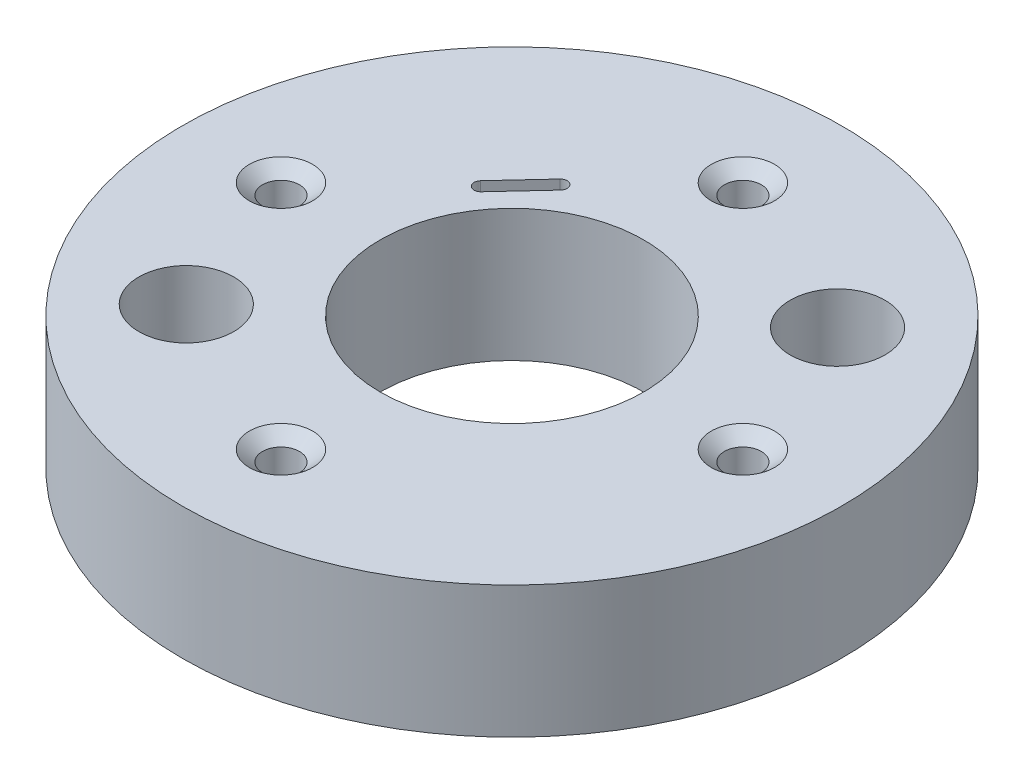
ISO-10303-21;
HEADER;
FILE_DESCRIPTION(('STEP AP214'),'2;1');
FILE_NAME('part.step','',(''),(''),'','','');
FILE_SCHEMA(('AUTOMOTIVE_DESIGN { 1 0 10303 214 1 1 1 1 }'));
ENDSEC;
DATA;
#1=APPLICATION_CONTEXT('core data for automotive mechanical design processes');
#2=APPLICATION_PROTOCOL_DEFINITION('international standard','automotive_design',2000,#1);
#3=PRODUCT_CONTEXT('',#1,'mechanical');
#4=PRODUCT('Part','Part','',(#3));
#5=PRODUCT_RELATED_PRODUCT_CATEGORY('part','',(#4));
#6=PRODUCT_DEFINITION_FORMATION('','',#4);
#7=PRODUCT_DEFINITION_CONTEXT('part definition',#1,'design');
#8=PRODUCT_DEFINITION('design','',#6,#7);
#9=PRODUCT_DEFINITION_SHAPE('','',#8);
#10=(LENGTH_UNIT() NAMED_UNIT(*) SI_UNIT(.MILLI.,.METRE.));
#11=(NAMED_UNIT(*) PLANE_ANGLE_UNIT() SI_UNIT($,.RADIAN.));
#12=(NAMED_UNIT(*) SI_UNIT($,.STERADIAN.) SOLID_ANGLE_UNIT());
#13=UNCERTAINTY_MEASURE_WITH_UNIT(LENGTH_MEASURE(1.E-05),#10,'distance_accuracy_value','');
#14=(GEOMETRIC_REPRESENTATION_CONTEXT(3) GLOBAL_UNCERTAINTY_ASSIGNED_CONTEXT((#13)) GLOBAL_UNIT_ASSIGNED_CONTEXT((#10,
#11,#12)) REPRESENTATION_CONTEXT('',''));
#15=CARTESIAN_POINT('',(0.,0.,0.));
#16=DIRECTION('',(0.,0.,1.));
#17=DIRECTION('',(1.,0.,0.));
#18=AXIS2_PLACEMENT_3D('',#15,#16,#17);
#19=CARTESIAN_POINT('',(0.,6.35,0.));
#20=DIRECTION('',(0.,1.,0.));
#21=DIRECTION('',(0.,0.,1.));
#22=AXIS2_PLACEMENT_3D('',#19,#20,#21);
#23=PLANE('',#22);
#24=CARTESIAN_POINT('',(-8.32891159723607,6.35,7.35641814033341));
#25=DIRECTION('',(0.,1.,0.));
#26=DIRECTION('',(0.,0.,-1.));
#27=AXIS2_PLACEMENT_3D('',#24,#25,#26);
#28=CIRCLE('',#27,2.286);
#29=CARTESIAN_POINT('',(-8.32891159723607,6.35,5.07041814033341));
#30=VERTEX_POINT('',#29);
#31=EDGE_CURVE('E103',#30,#30,#28,.T.);
#32=ORIENTED_EDGE('',*,*,#31,.F.);
#33=EDGE_LOOP('',(#32));
#34=FACE_BOUND('',#33,.T.);
#35=CARTESIAN_POINT('',(8.32891159723607,6.35,-7.35641814033341));
#36=DIRECTION('',(0.,1.,0.));
#37=DIRECTION('',(0.,0.,1.));
#38=AXIS2_PLACEMENT_3D('',#35,#36,#37);
#39=CIRCLE('',#38,2.286);
#40=CARTESIAN_POINT('',(8.32891159723607,6.35,-5.07041814033341));
#41=VERTEX_POINT('',#40);
#42=EDGE_CURVE('E126',#41,#41,#39,.T.);
#43=ORIENTED_EDGE('',*,*,#42,.F.);
#44=EDGE_LOOP('',(#43));
#45=FACE_BOUND('',#44,.T.);
#46=CARTESIAN_POINT('',(-11.1252,6.35,0.));
#47=DIRECTION('',(0.,1.,0.));
#48=DIRECTION('',(0.,0.,1.));
#49=AXIS2_PLACEMENT_3D('',#46,#47,#48);
#50=CIRCLE('',#49,1.524);
#51=CARTESIAN_POINT('',(-11.1252,6.35,1.524));
#52=VERTEX_POINT('',#51);
#53=EDGE_CURVE('E132',#52,#52,#50,.T.);
#54=ORIENTED_EDGE('',*,*,#53,.F.);
#55=EDGE_LOOP('',(#54));
#56=FACE_BOUND('',#55,.T.);
#57=CARTESIAN_POINT('',(11.1252,6.35,0.));
#58=DIRECTION('',(0.,1.,0.));
#59=DIRECTION('',(0.,0.,1.));
#60=AXIS2_PLACEMENT_3D('',#57,#58,#59);
#61=CIRCLE('',#60,1.524);
#62=CARTESIAN_POINT('',(11.1252,6.35,1.524));
#63=VERTEX_POINT('',#62);
#64=EDGE_CURVE('E143',#63,#63,#61,.T.);
#65=ORIENTED_EDGE('',*,*,#64,.F.);
#66=EDGE_LOOP('',(#65));
#67=FACE_BOUND('',#66,.T.);
#68=CARTESIAN_POINT('',(0.,6.35,11.1252));
#69=DIRECTION('',(0.,1.,0.));
#70=DIRECTION('',(0.,0.,1.));
#71=AXIS2_PLACEMENT_3D('',#68,#69,#70);
#72=CIRCLE('',#71,1.524);
#73=CARTESIAN_POINT('',(0.,6.35,12.6492));
#74=VERTEX_POINT('',#73);
#75=EDGE_CURVE('E152',#74,#74,#72,.T.);
#76=ORIENTED_EDGE('',*,*,#75,.F.);
#77=EDGE_LOOP('',(#76));
#78=FACE_BOUND('',#77,.T.);
#79=CARTESIAN_POINT('',(0.,6.35,-11.1252));
#80=DIRECTION('',(0.,1.,0.));
#81=DIRECTION('',(0.,0.,1.));
#82=AXIS2_PLACEMENT_3D('',#79,#80,#81);
#83=CIRCLE('',#82,1.524);
#84=CARTESIAN_POINT('',(0.,6.35,-9.6012));
#85=VERTEX_POINT('',#84);
#86=EDGE_CURVE('E161',#85,#85,#83,.T.);
#87=ORIENTED_EDGE('',*,*,#86,.F.);
#88=EDGE_LOOP('',(#87));
#89=FACE_BOUND('',#88,.T.);
#90=CARTESIAN_POINT('',(0.,6.35,0.));
#91=DIRECTION('',(0.,1.,0.));
#92=DIRECTION('',(0.,0.,1.));
#93=AXIS2_PLACEMENT_3D('',#90,#91,#92);
#94=CIRCLE('',#93,6.35);
#95=CARTESIAN_POINT('',(0.,6.35,6.35));
#96=VERTEX_POINT('',#95);
#97=EDGE_CURVE('E170',#96,#96,#94,.T.);
#98=ORIENTED_EDGE('',*,*,#97,.F.);
#99=EDGE_LOOP('',(#98));
#100=FACE_BOUND('',#99,.T.);
#101=CARTESIAN_POINT('',(0.,6.35,0.));
#102=DIRECTION('',(0.,1.,0.));
#103=DIRECTION('',(0.,0.,1.));
#104=AXIS2_PLACEMENT_3D('',#101,#102,#103);
#105=CIRCLE('',#104,15.875);
#106=CARTESIAN_POINT('',(0.,6.35,15.875));
#107=VERTEX_POINT('',#106);
#108=EDGE_CURVE('E11',#107,#107,#105,.T.);
#109=ORIENTED_EDGE('',*,*,#108,.T.);
#110=EDGE_LOOP('',(#109));
#111=FACE_BOUND('',#110,.T.);
#112=CARTESIAN_POINT('',(-6.15769241715111,6.35,-4.66085783906228));
#113=DIRECTION('',(0.,1.,0.));
#114=DIRECTION('',(0.,0.,1.));
#115=AXIS2_PLACEMENT_3D('',#112,#113,#114);
#116=CIRCLE('',#115,0.327254868180187);
#117=CARTESIAN_POINT('',(-6.39758263951138,6.35,-4.88345260531605));
#118=VERTEX_POINT('',#117);
#119=CARTESIAN_POINT('',(-5.91780219479084,6.35,-4.43826307280851));
#120=VERTEX_POINT('',#119);
#121=EDGE_CURVE('E96',#118,#120,#116,.T.);
#122=ORIENTED_EDGE('',*,*,#121,.F.);
#123=DIRECTION('',(0.680187792137623,0.,-0.733037903131172));
#124=VECTOR('',#123,1.);
#125=CARTESIAN_POINT('',(-6.39758263951138,6.35,-4.88345260531605));
#126=LINE('',#125,#124);
#127=CARTESIAN_POINT('',(-4.55415128901584,6.35,-6.87011726962409));
#128=VERTEX_POINT('',#127);
#129=EDGE_CURVE('E55',#118,#128,#126,.T.);
#130=ORIENTED_EDGE('',*,*,#129,.T.);
#131=CARTESIAN_POINT('',(-4.31426106665557,6.35,-6.64752250337032));
#132=DIRECTION('',(0.,1.,0.));
#133=DIRECTION('',(0.,0.,1.));
#134=AXIS2_PLACEMENT_3D('',#131,#132,#133);
#135=CIRCLE('',#134,0.327254868180187);
#136=CARTESIAN_POINT('',(-4.07437084429529,6.35,-6.42492773711655));
#137=VERTEX_POINT('',#136);
#138=EDGE_CURVE('E102',#137,#128,#135,.T.);
#139=ORIENTED_EDGE('',*,*,#138,.F.);
#140=DIRECTION('',(0.680187792137623,0.,-0.733037903131172));
#141=VECTOR('',#140,1.);
#142=CARTESIAN_POINT('',(-5.91780219479084,6.35,-4.43826307280851));
#143=LINE('',#142,#141);
#144=EDGE_CURVE('E114',#120,#137,#143,.T.);
#145=ORIENTED_EDGE('',*,*,#144,.F.);
#146=EDGE_LOOP('',(#122,#130,#139,#145));
#147=FACE_BOUND('',#146,.T.);
#148=ADVANCED_FACE('F40',(#34,#45,#56,#67,#78,#89,#100,#111,#147),#23,.T.);
#149=CARTESIAN_POINT('',(0.,0.,0.));
#150=DIRECTION('',(0.,1.,0.));
#151=DIRECTION('',(0.,0.,1.));
#152=AXIS2_PLACEMENT_3D('',#149,#150,#151);
#153=PLANE('',#152);
#154=CARTESIAN_POINT('',(0.,0.,0.));
#155=DIRECTION('',(0.,1.,0.));
#156=DIRECTION('',(0.,0.,1.));
#157=AXIS2_PLACEMENT_3D('',#154,#155,#156);
#158=CIRCLE('',#157,15.875);
#159=CARTESIAN_POINT('',(0.,0.,15.875));
#160=VERTEX_POINT('',#159);
#161=EDGE_CURVE('E44',#160,#160,#158,.T.);
#162=ORIENTED_EDGE('',*,*,#161,.F.);
#163=EDGE_LOOP('',(#162));
#164=FACE_BOUND('',#163,.T.);
#165=CARTESIAN_POINT('',(0.,0.,0.));
#166=DIRECTION('',(0.,1.,0.));
#167=DIRECTION('',(0.,0.,1.));
#168=AXIS2_PLACEMENT_3D('',#165,#166,#167);
#169=CIRCLE('',#168,6.35);
#170=CARTESIAN_POINT('',(0.,0.,6.35));
#171=VERTEX_POINT('',#170);
#172=EDGE_CURVE('E171',#171,#171,#169,.T.);
#173=ORIENTED_EDGE('',*,*,#172,.T.);
#174=EDGE_LOOP('',(#173));
#175=FACE_BOUND('',#174,.T.);
#176=CARTESIAN_POINT('',(0.,0.,-11.1252));
#177=DIRECTION('',(0.,1.,0.));
#178=DIRECTION('',(0.,0.,1.));
#179=AXIS2_PLACEMENT_3D('',#176,#177,#178);
#180=CIRCLE('',#179,0.888999999999998);
#181=CARTESIAN_POINT('',(0.,0.,-10.2362));
#182=VERTEX_POINT('',#181);
#183=EDGE_CURVE('E167',#182,#182,#180,.T.);
#184=ORIENTED_EDGE('',*,*,#183,.T.);
#185=EDGE_LOOP('',(#184));
#186=FACE_BOUND('',#185,.T.);
#187=CARTESIAN_POINT('',(0.,0.,11.1252));
#188=DIRECTION('',(0.,1.,0.));
#189=DIRECTION('',(0.,0.,1.));
#190=AXIS2_PLACEMENT_3D('',#187,#188,#189);
#191=CIRCLE('',#190,0.888999999999998);
#192=CARTESIAN_POINT('',(0.,0.,12.0142));
#193=VERTEX_POINT('',#192);
#194=EDGE_CURVE('E158',#193,#193,#191,.T.);
#195=ORIENTED_EDGE('',*,*,#194,.T.);
#196=EDGE_LOOP('',(#195));
#197=FACE_BOUND('',#196,.T.);
#198=CARTESIAN_POINT('',(8.32891159723607,0.,-7.35641814033341));
#199=DIRECTION('',(0.,1.,0.));
#200=DIRECTION('',(0.,0.,1.));
#201=AXIS2_PLACEMENT_3D('',#198,#199,#200);
#202=CIRCLE('',#201,2.286);
#203=CARTESIAN_POINT('',(8.32891159723607,0.,-5.07041814033341));
#204=VERTEX_POINT('',#203);
#205=EDGE_CURVE('E129',#204,#204,#202,.T.);
#206=ORIENTED_EDGE('',*,*,#205,.T.);
#207=EDGE_LOOP('',(#206));
#208=FACE_BOUND('',#207,.T.);
#209=CARTESIAN_POINT('',(-8.32891159723607,0.,7.35641814033341));
#210=DIRECTION('',(0.,1.,0.));
#211=DIRECTION('',(0.,0.,-1.));
#212=AXIS2_PLACEMENT_3D('',#209,#210,#211);
#213=CIRCLE('',#212,2.286);
#214=CARTESIAN_POINT('',(-8.32891159723607,0.,5.07041814033341));
#215=VERTEX_POINT('',#214);
#216=EDGE_CURVE('E123',#215,#215,#213,.T.);
#217=ORIENTED_EDGE('',*,*,#216,.T.);
#218=EDGE_LOOP('',(#217));
#219=FACE_BOUND('',#218,.T.);
#220=DIRECTION('',(0.680187792137623,0.,-0.733037903131172));
#221=VECTOR('',#220,1.);
#222=CARTESIAN_POINT('',(-6.39758263951138,0.,-4.88345260531605));
#223=LINE('',#222,#221);
#224=CARTESIAN_POINT('',(-6.39758263951138,0.,-4.88345260531605));
#225=VERTEX_POINT('',#224);
#226=CARTESIAN_POINT('',(-4.55415128901584,0.,-6.87011726962409));
#227=VERTEX_POINT('',#226);
#228=EDGE_CURVE('E85',#225,#227,#223,.T.);
#229=ORIENTED_EDGE('',*,*,#228,.F.);
#230=CARTESIAN_POINT('',(-6.15769241715111,0.,-4.66085783906228));
#231=DIRECTION('',(0.,1.,0.));
#232=DIRECTION('',(0.,0.,1.));
#233=AXIS2_PLACEMENT_3D('',#230,#231,#232);
#234=CIRCLE('',#233,0.327254868180187);
#235=CARTESIAN_POINT('',(-5.91780219479084,0.,-4.43826307280851));
#236=VERTEX_POINT('',#235);
#237=EDGE_CURVE('E108',#225,#236,#234,.T.);
#238=ORIENTED_EDGE('',*,*,#237,.T.);
#239=DIRECTION('',(0.680187792137623,0.,-0.733037903131172));
#240=VECTOR('',#239,1.);
#241=CARTESIAN_POINT('',(-5.91780219479084,0.,-4.43826307280851));
#242=LINE('',#241,#240);
#243=CARTESIAN_POINT('',(-4.07437084429529,0.,-6.42492773711655));
#244=VERTEX_POINT('',#243);
#245=EDGE_CURVE('E63',#236,#244,#242,.T.);
#246=ORIENTED_EDGE('',*,*,#245,.T.);
#247=CARTESIAN_POINT('',(-4.31426106665557,0.,-6.64752250337032));
#248=DIRECTION('',(0.,1.,0.));
#249=DIRECTION('',(0.,0.,1.));
#250=AXIS2_PLACEMENT_3D('',#247,#248,#249);
#251=CIRCLE('',#250,0.327254868180187);
#252=EDGE_CURVE('E95',#244,#227,#251,.T.);
#253=ORIENTED_EDGE('',*,*,#252,.T.);
#254=EDGE_LOOP('',(#229,#238,#246,#253));
#255=FACE_BOUND('',#254,.T.);
#256=ADVANCED_FACE('F106',(#164,#175,#186,#197,#208,#219,#255),#153,.F.);
#257=CARTESIAN_POINT('',(0.,6.35,0.));
#258=DIRECTION('',(0.,-1.,0.));
#259=DIRECTION('',(0.,0.,-1.));
#260=AXIS2_PLACEMENT_3D('',#257,#258,#259);
#261=CYLINDRICAL_SURFACE('',#260,15.875);
#262=ORIENTED_EDGE('',*,*,#108,.F.);
#263=EDGE_LOOP('',(#262));
#264=FACE_BOUND('',#263,.T.);
#265=ORIENTED_EDGE('',*,*,#161,.T.);
#266=EDGE_LOOP('',(#265));
#267=FACE_BOUND('',#266,.T.);
#268=ADVANCED_FACE('F42',(#264,#267),#261,.T.);
#269=CARTESIAN_POINT('',(0.,0.,0.));
#270=DIRECTION('',(0.,1.,0.));
#271=DIRECTION('',(0.,0.,1.));
#272=AXIS2_PLACEMENT_3D('',#269,#270,#271);
#273=CYLINDRICAL_SURFACE('',#272,6.35);
#274=ORIENTED_EDGE('',*,*,#172,.F.);
#275=EDGE_LOOP('',(#274));
#276=FACE_BOUND('',#275,.T.);
#277=ORIENTED_EDGE('',*,*,#97,.T.);
#278=EDGE_LOOP('',(#277));
#279=FACE_BOUND('',#278,.T.);
#280=ADVANCED_FACE('F177',(#276,#279),#273,.F.);
#281=CARTESIAN_POINT('',(0.,6.35,-11.1252));
#282=DIRECTION('',(0.,1.,0.));
#283=DIRECTION('',(0.,0.,1.));
#284=AXIS2_PLACEMENT_3D('',#281,#282,#283);
#285=CYLINDRICAL_SURFACE('',#284,0.888999999999999);
#286=ORIENTED_EDGE('',*,*,#183,.F.);
#287=EDGE_LOOP('',(#286));
#288=FACE_BOUND('',#287,.T.);
#289=CARTESIAN_POINT('',(0.,5.81717173420243,-11.1252));
#290=DIRECTION('',(0.,1.,0.));
#291=DIRECTION('',(0.,0.,1.));
#292=AXIS2_PLACEMENT_3D('',#289,#290,#291);
#293=CIRCLE('',#292,0.888999999999999);
#294=CARTESIAN_POINT('',(0.,5.81717173420243,-10.2362));
#295=VERTEX_POINT('',#294);
#296=EDGE_CURVE('E164',#295,#295,#293,.T.);
#297=ORIENTED_EDGE('',*,*,#296,.T.);
#298=EDGE_LOOP('',(#297));
#299=FACE_BOUND('',#298,.T.);
#300=ADVANCED_FACE('F244',(#288,#299),#285,.F.);
#301=CARTESIAN_POINT('',(0.,6.35,-11.1252));
#302=DIRECTION('',(0.,1.,0.));
#303=DIRECTION('',(0.,0.,1.));
#304=AXIS2_PLACEMENT_3D('',#301,#302,#303);
#305=CONICAL_SURFACE('',#304,1.524,0.872664625997164);
#306=ORIENTED_EDGE('',*,*,#296,.F.);
#307=EDGE_LOOP('',(#306));
#308=FACE_BOUND('',#307,.T.);
#309=ORIENTED_EDGE('',*,*,#86,.T.);
#310=EDGE_LOOP('',(#309));
#311=FACE_BOUND('',#310,.T.);
#312=ADVANCED_FACE('F240',(#308,#311),#305,.F.);
#313=CARTESIAN_POINT('',(0.,6.35,11.1252));
#314=DIRECTION('',(0.,1.,0.));
#315=DIRECTION('',(0.,0.,1.));
#316=AXIS2_PLACEMENT_3D('',#313,#314,#315);
#317=CYLINDRICAL_SURFACE('',#316,0.888999999999999);
#318=ORIENTED_EDGE('',*,*,#194,.F.);
#319=EDGE_LOOP('',(#318));
#320=FACE_BOUND('',#319,.T.);
#321=CARTESIAN_POINT('',(0.,5.81717173420243,11.1252));
#322=DIRECTION('',(0.,1.,0.));
#323=DIRECTION('',(0.,0.,1.));
#324=AXIS2_PLACEMENT_3D('',#321,#322,#323);
#325=CIRCLE('',#324,0.888999999999999);
#326=CARTESIAN_POINT('',(0.,5.81717173420243,12.0142));
#327=VERTEX_POINT('',#326);
#328=EDGE_CURVE('E155',#327,#327,#325,.T.);
#329=ORIENTED_EDGE('',*,*,#328,.T.);
#330=EDGE_LOOP('',(#329));
#331=FACE_BOUND('',#330,.T.);
#332=ADVANCED_FACE('F236',(#320,#331),#317,.F.);
#333=CARTESIAN_POINT('',(0.,6.35,11.1252));
#334=DIRECTION('',(0.,1.,0.));
#335=DIRECTION('',(0.,0.,1.));
#336=AXIS2_PLACEMENT_3D('',#333,#334,#335);
#337=CONICAL_SURFACE('',#336,1.524,0.872664625997164);
#338=ORIENTED_EDGE('',*,*,#328,.F.);
#339=EDGE_LOOP('',(#338));
#340=FACE_BOUND('',#339,.T.);
#341=ORIENTED_EDGE('',*,*,#75,.T.);
#342=EDGE_LOOP('',(#341));
#343=FACE_BOUND('',#342,.T.);
#344=ADVANCED_FACE('F232',(#340,#343),#337,.F.);
#345=CARTESIAN_POINT('',(11.1252,2.54,0.));
#346=DIRECTION('',(0.,1.,0.));
#347=DIRECTION('',(0.,0.,1.));
#348=AXIS2_PLACEMENT_3D('',#345,#346,#347);
#349=CONICAL_SURFACE('',#348,0.888999999999999,1.02974425867665);
#350=CARTESIAN_POINT('',(11.1252,2.0058349096845,0.));
#351=VERTEX_POINT('',#350);
#352=VERTEX_LOOP('',#351);
#353=FACE_BOUND('',#352,.T.);
#354=CARTESIAN_POINT('',(11.1252,2.54,0.));
#355=DIRECTION('',(0.,1.,0.));
#356=DIRECTION('',(0.,0.,1.));
#357=AXIS2_PLACEMENT_3D('',#354,#355,#356);
#358=CIRCLE('',#357,0.888999999999999);
#359=CARTESIAN_POINT('',(11.1252,2.54,0.888999999999999));
#360=VERTEX_POINT('',#359);
#361=EDGE_CURVE('E149',#360,#360,#358,.T.);
#362=ORIENTED_EDGE('',*,*,#361,.T.);
#363=EDGE_LOOP('',(#362));
#364=FACE_BOUND('',#363,.T.);
#365=ADVANCED_FACE('F228',(#353,#364),#349,.F.);
#366=CARTESIAN_POINT('',(11.1252,6.35,0.));
#367=DIRECTION('',(0.,1.,0.));
#368=DIRECTION('',(0.,0.,1.));
#369=AXIS2_PLACEMENT_3D('',#366,#367,#368);
#370=CYLINDRICAL_SURFACE('',#369,0.888999999999999);
#371=ORIENTED_EDGE('',*,*,#361,.F.);
#372=EDGE_LOOP('',(#371));
#373=FACE_BOUND('',#372,.T.);
#374=CARTESIAN_POINT('',(11.1252,5.81717173420243,0.));
#375=DIRECTION('',(0.,1.,0.));
#376=DIRECTION('',(0.,0.,1.));
#377=AXIS2_PLACEMENT_3D('',#374,#375,#376);
#378=CIRCLE('',#377,0.888999999999999);
#379=CARTESIAN_POINT('',(11.1252,5.81717173420243,0.888999999999999));
#380=VERTEX_POINT('',#379);
#381=EDGE_CURVE('E146',#380,#380,#378,.T.);
#382=ORIENTED_EDGE('',*,*,#381,.T.);
#383=EDGE_LOOP('',(#382));
#384=FACE_BOUND('',#383,.T.);
#385=ADVANCED_FACE('F224',(#373,#384),#370,.F.);
#386=CARTESIAN_POINT('',(11.1252,6.35,0.));
#387=DIRECTION('',(0.,1.,0.));
#388=DIRECTION('',(0.,0.,1.));
#389=AXIS2_PLACEMENT_3D('',#386,#387,#388);
#390=CONICAL_SURFACE('',#389,1.524,0.872664625997164);
#391=ORIENTED_EDGE('',*,*,#381,.F.);
#392=EDGE_LOOP('',(#391));
#393=FACE_BOUND('',#392,.T.);
#394=ORIENTED_EDGE('',*,*,#64,.T.);
#395=EDGE_LOOP('',(#394));
#396=FACE_BOUND('',#395,.T.);
#397=ADVANCED_FACE('F220',(#393,#396),#390,.F.);
#398=CARTESIAN_POINT('',(-11.1252,2.54,0.));
#399=DIRECTION('',(0.,1.,0.));
#400=DIRECTION('',(0.,0.,1.));
#401=AXIS2_PLACEMENT_3D('',#398,#399,#400);
#402=CONICAL_SURFACE('',#401,0.888999999999999,1.02974425867665);
#403=CARTESIAN_POINT('',(-11.1252,2.0058349096845,0.));
#404=VERTEX_POINT('',#403);
#405=VERTEX_LOOP('',#404);
#406=FACE_BOUND('',#405,.T.);
#407=CARTESIAN_POINT('',(-11.1252,2.54,0.));
#408=DIRECTION('',(0.,1.,0.));
#409=DIRECTION('',(0.,0.,1.));
#410=AXIS2_PLACEMENT_3D('',#407,#408,#409);
#411=CIRCLE('',#410,0.888999999999999);
#412=CARTESIAN_POINT('',(-11.1252,2.54,0.888999999999999));
#413=VERTEX_POINT('',#412);
#414=EDGE_CURVE('E140',#413,#413,#411,.T.);
#415=ORIENTED_EDGE('',*,*,#414,.T.);
#416=EDGE_LOOP('',(#415));
#417=FACE_BOUND('',#416,.T.);
#418=ADVANCED_FACE('F216',(#406,#417),#402,.F.);
#419=CARTESIAN_POINT('',(-11.1252,6.35,0.));
#420=DIRECTION('',(0.,1.,0.));
#421=DIRECTION('',(0.,0.,1.));
#422=AXIS2_PLACEMENT_3D('',#419,#420,#421);
#423=CYLINDRICAL_SURFACE('',#422,0.888999999999999);
#424=ORIENTED_EDGE('',*,*,#414,.F.);
#425=EDGE_LOOP('',(#424));
#426=FACE_BOUND('',#425,.T.);
#427=CARTESIAN_POINT('',(-11.1252,5.81717173420243,0.));
#428=DIRECTION('',(0.,1.,0.));
#429=DIRECTION('',(0.,0.,1.));
#430=AXIS2_PLACEMENT_3D('',#427,#428,#429);
#431=CIRCLE('',#430,0.888999999999999);
#432=CARTESIAN_POINT('',(-11.1252,5.81717173420243,0.888999999999999));
#433=VERTEX_POINT('',#432);
#434=EDGE_CURVE('E137',#433,#433,#431,.T.);
#435=ORIENTED_EDGE('',*,*,#434,.T.);
#436=EDGE_LOOP('',(#435));
#437=FACE_BOUND('',#436,.T.);
#438=ADVANCED_FACE('F212',(#426,#437),#423,.F.);
#439=CARTESIAN_POINT('',(-11.1252,6.35,0.));
#440=DIRECTION('',(0.,1.,0.));
#441=DIRECTION('',(0.,0.,1.));
#442=AXIS2_PLACEMENT_3D('',#439,#440,#441);
#443=CONICAL_SURFACE('',#442,1.524,0.872664625997164);
#444=ORIENTED_EDGE('',*,*,#434,.F.);
#445=EDGE_LOOP('',(#444));
#446=FACE_BOUND('',#445,.T.);
#447=ORIENTED_EDGE('',*,*,#53,.T.);
#448=EDGE_LOOP('',(#447));
#449=FACE_BOUND('',#448,.T.);
#450=ADVANCED_FACE('F208',(#446,#449),#443,.F.);
#451=CARTESIAN_POINT('',(8.32891159723607,0.,-7.35641814033341));
#452=DIRECTION('',(0.,1.,0.));
#453=DIRECTION('',(0.,0.,1.));
#454=AXIS2_PLACEMENT_3D('',#451,#452,#453);
#455=CYLINDRICAL_SURFACE('',#454,2.286);
#456=ORIENTED_EDGE('',*,*,#205,.F.);
#457=EDGE_LOOP('',(#456));
#458=FACE_BOUND('',#457,.T.);
#459=ORIENTED_EDGE('',*,*,#42,.T.);
#460=EDGE_LOOP('',(#459));
#461=FACE_BOUND('',#460,.T.);
#462=ADVANCED_FACE('F204',(#458,#461),#455,.F.);
#463=CARTESIAN_POINT('',(-8.32891159723607,0.,7.35641814033341));
#464=DIRECTION('',(0.,1.,0.));
#465=DIRECTION('',(0.,0.,1.));
#466=AXIS2_PLACEMENT_3D('',#463,#464,#465);
#467=CYLINDRICAL_SURFACE('',#466,2.286);
#468=ORIENTED_EDGE('',*,*,#216,.F.);
#469=EDGE_LOOP('',(#468));
#470=FACE_BOUND('',#469,.T.);
#471=ORIENTED_EDGE('',*,*,#31,.T.);
#472=EDGE_LOOP('',(#471));
#473=FACE_BOUND('',#472,.T.);
#474=ADVANCED_FACE('F201',(#470,#473),#467,.F.);
#475=CARTESIAN_POINT('',(-6.39758263951138,0.,-4.88345260531605));
#476=DIRECTION('',(0.733037903131172,0.,0.680187792137623));
#477=DIRECTION('',(0.680187792137623,0.,-0.733037903131172));
#478=AXIS2_PLACEMENT_3D('',#475,#476,#477);
#479=PLANE('',#478);
#480=ORIENTED_EDGE('',*,*,#129,.F.);
#481=DIRECTION('',(0.,1.,0.));
#482=VECTOR('',#481,1.);
#483=CARTESIAN_POINT('',(-6.39758263951138,0.,-4.88345260531605));
#484=LINE('',#483,#482);
#485=EDGE_CURVE('E90',#225,#118,#484,.T.);
#486=ORIENTED_EDGE('',*,*,#485,.F.);
#487=ORIENTED_EDGE('',*,*,#228,.T.);
#488=DIRECTION('',(0.,1.,0.));
#489=VECTOR('',#488,1.);
#490=CARTESIAN_POINT('',(-4.55415128901584,0.,-6.87011726962409));
#491=LINE('',#490,#489);
#492=EDGE_CURVE('E88',#227,#128,#491,.T.);
#493=ORIENTED_EDGE('',*,*,#492,.T.);
#494=EDGE_LOOP('',(#480,#486,#487,#493));
#495=FACE_BOUND('',#494,.T.);
#496=ADVANCED_FACE('F87',(#495),#479,.T.);
#497=CARTESIAN_POINT('',(-4.31426106665557,0.,-6.64752250337032));
#498=DIRECTION('',(0.,1.,0.));
#499=DIRECTION('',(0.,0.,1.));
#500=AXIS2_PLACEMENT_3D('',#497,#498,#499);
#501=CYLINDRICAL_SURFACE('',#500,0.327254868180187);
#502=ORIENTED_EDGE('',*,*,#138,.T.);
#503=ORIENTED_EDGE('',*,*,#492,.F.);
#504=ORIENTED_EDGE('',*,*,#252,.F.);
#505=DIRECTION('',(0.,1.,0.));
#506=VECTOR('',#505,1.);
#507=CARTESIAN_POINT('',(-4.07437084429529,0.,-6.42492773711655));
#508=LINE('',#507,#506);
#509=EDGE_CURVE('E104',#244,#137,#508,.T.);
#510=ORIENTED_EDGE('',*,*,#509,.T.);
#511=EDGE_LOOP('',(#502,#503,#504,#510));
#512=FACE_BOUND('',#511,.T.);
#513=ADVANCED_FACE('F100',(#512),#501,.F.);
#514=CARTESIAN_POINT('',(-5.91780219479084,0.,-4.43826307280851));
#515=DIRECTION('',(0.733037903131172,0.,0.680187792137623));
#516=DIRECTION('',(0.680187792137623,0.,-0.733037903131172));
#517=AXIS2_PLACEMENT_3D('',#514,#515,#516);
#518=PLANE('',#517);
#519=ORIENTED_EDGE('',*,*,#144,.T.);
#520=ORIENTED_EDGE('',*,*,#509,.F.);
#521=ORIENTED_EDGE('',*,*,#245,.F.);
#522=DIRECTION('',(0.,1.,0.));
#523=VECTOR('',#522,1.);
#524=CARTESIAN_POINT('',(-5.91780219479084,0.,-4.43826307280851));
#525=LINE('',#524,#523);
#526=EDGE_CURVE('E120',#236,#120,#525,.T.);
#527=ORIENTED_EDGE('',*,*,#526,.T.);
#528=EDGE_LOOP('',(#519,#520,#521,#527));
#529=FACE_BOUND('',#528,.T.);
#530=ADVANCED_FACE('F189',(#529),#518,.F.);
#531=CARTESIAN_POINT('',(-6.15769241715111,0.,-4.66085783906228));
#532=DIRECTION('',(0.,1.,0.));
#533=DIRECTION('',(0.,0.,1.));
#534=AXIS2_PLACEMENT_3D('',#531,#532,#533);
#535=CYLINDRICAL_SURFACE('',#534,0.327254868180187);
#536=ORIENTED_EDGE('',*,*,#121,.T.);
#537=ORIENTED_EDGE('',*,*,#526,.F.);
#538=ORIENTED_EDGE('',*,*,#237,.F.);
#539=ORIENTED_EDGE('',*,*,#485,.T.);
#540=EDGE_LOOP('',(#536,#537,#538,#539));
#541=FACE_BOUND('',#540,.T.);
#542=ADVANCED_FACE('F188',(#541),#535,.F.);
#543=CLOSED_SHELL('',(#148,#256,#268,#280,#300,#312,#332,#344,#365,#385,#397,#418,#438,#450,
#462,#474,#496,#513,#530,#542));
#544=MANIFOLD_SOLID_BREP('B2',#543);
#545=ADVANCED_BREP_SHAPE_REPRESENTATION('',(#18,#544),#14);
#546=SHAPE_DEFINITION_REPRESENTATION(#9,#545);
ENDSEC;
END-ISO-10303-21;
